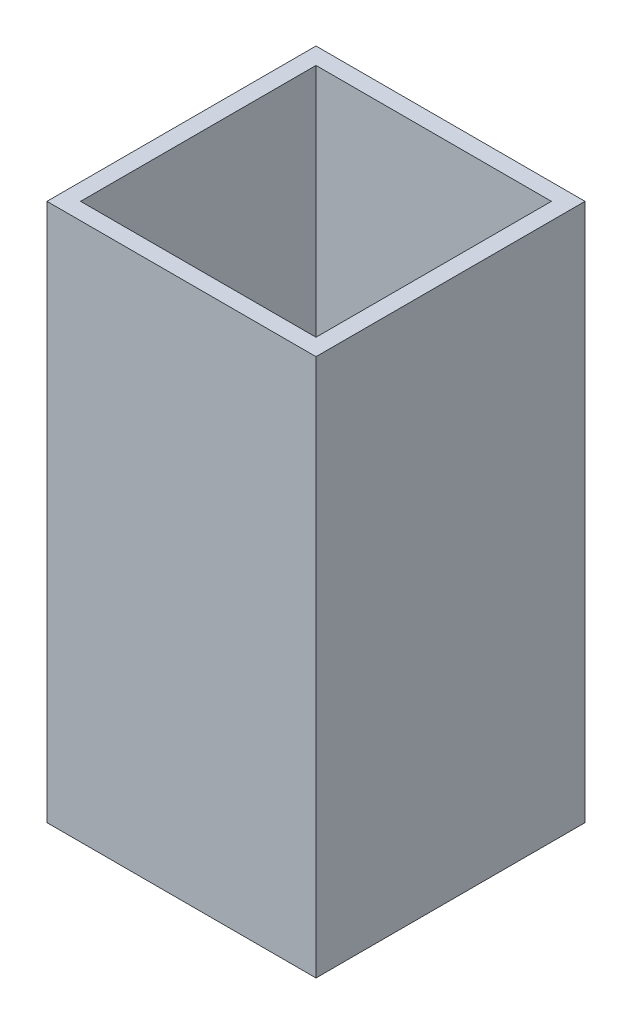
ISO-10303-21;
HEADER;
FILE_DESCRIPTION(('STEP AP214'),'2;1');
FILE_NAME('part.step','',(''),(''),'','','');
FILE_SCHEMA(('AUTOMOTIVE_DESIGN { 1 0 10303 214 1 1 1 1 }'));
ENDSEC;
DATA;
#1=APPLICATION_CONTEXT('core data for automotive mechanical design processes');
#2=APPLICATION_PROTOCOL_DEFINITION('international standard','automotive_design',2000,#1);
#3=PRODUCT_CONTEXT('',#1,'mechanical');
#4=PRODUCT('Part','Part','',(#3));
#5=PRODUCT_RELATED_PRODUCT_CATEGORY('part','',(#4));
#6=PRODUCT_DEFINITION_FORMATION('','',#4);
#7=PRODUCT_DEFINITION_CONTEXT('part definition',#1,'design');
#8=PRODUCT_DEFINITION('design','',#6,#7);
#9=PRODUCT_DEFINITION_SHAPE('','',#8);
#10=(LENGTH_UNIT() NAMED_UNIT(*) SI_UNIT(.MILLI.,.METRE.));
#11=(NAMED_UNIT(*) PLANE_ANGLE_UNIT() SI_UNIT($,.RADIAN.));
#12=(NAMED_UNIT(*) SI_UNIT($,.STERADIAN.) SOLID_ANGLE_UNIT());
#13=UNCERTAINTY_MEASURE_WITH_UNIT(LENGTH_MEASURE(1.E-05),#10,'distance_accuracy_value','');
#14=(GEOMETRIC_REPRESENTATION_CONTEXT(3) GLOBAL_UNCERTAINTY_ASSIGNED_CONTEXT((#13)) GLOBAL_UNIT_ASSIGNED_CONTEXT((#10,
#11,#12)) REPRESENTATION_CONTEXT('',''));
#15=CARTESIAN_POINT('',(0.,0.,0.));
#16=DIRECTION('',(0.,0.,1.));
#17=DIRECTION('',(1.,0.,0.));
#18=AXIS2_PLACEMENT_3D('',#15,#16,#17);
#19=CARTESIAN_POINT('',(0.,50.8,0.));
#20=DIRECTION('',(0.,-1.,0.));
#21=DIRECTION('',(0.,0.,-1.));
#22=AXIS2_PLACEMENT_3D('',#19,#20,#21);
#23=PLANE('',#22);
#24=DIRECTION('',(0.,0.,1.));
#25=VECTOR('',#24,1.);
#26=CARTESIAN_POINT('',(-12.7,50.8,-12.7));
#27=LINE('',#26,#25);
#28=CARTESIAN_POINT('',(-12.7,50.8,-12.7));
#29=VERTEX_POINT('',#28);
#30=CARTESIAN_POINT('',(-12.7,50.8,12.7));
#31=VERTEX_POINT('',#30);
#32=EDGE_CURVE('E136',#29,#31,#27,.T.);
#33=ORIENTED_EDGE('',*,*,#32,.T.);
#34=DIRECTION('',(1.,0.,0.));
#35=VECTOR('',#34,1.);
#36=CARTESIAN_POINT('',(12.7,50.8,12.7));
#37=LINE('',#36,#35);
#38=CARTESIAN_POINT('',(12.7,50.8,12.7));
#39=VERTEX_POINT('',#38);
#40=EDGE_CURVE('E139',#31,#39,#37,.T.);
#41=ORIENTED_EDGE('',*,*,#40,.T.);
#42=DIRECTION('',(0.,0.,-1.));
#43=VECTOR('',#42,1.);
#44=CARTESIAN_POINT('',(12.7,50.8,-12.7));
#45=LINE('',#44,#43);
#46=CARTESIAN_POINT('',(12.7,50.8,-12.7));
#47=VERTEX_POINT('',#46);
#48=EDGE_CURVE('E142',#39,#47,#45,.T.);
#49=ORIENTED_EDGE('',*,*,#48,.T.);
#50=DIRECTION('',(-1.,0.,0.));
#51=VECTOR('',#50,1.);
#52=CARTESIAN_POINT('',(12.7,50.8,-12.7));
#53=LINE('',#52,#51);
#54=EDGE_CURVE('E144',#47,#29,#53,.T.);
#55=ORIENTED_EDGE('',*,*,#54,.T.);
#56=EDGE_LOOP('',(#33,#41,#49,#55));
#57=FACE_BOUND('',#56,.T.);
#58=DIRECTION('',(0.,0.,1.));
#59=VECTOR('',#58,1.);
#60=CARTESIAN_POINT('',(-11.1125,50.8,-11.1125));
#61=LINE('',#60,#59);
#62=CARTESIAN_POINT('',(-11.1125,50.8,-11.1125));
#63=VERTEX_POINT('',#62);
#64=CARTESIAN_POINT('',(-11.1125,50.8,11.1125));
#65=VERTEX_POINT('',#64);
#66=EDGE_CURVE('E100',#63,#65,#61,.T.);
#67=ORIENTED_EDGE('',*,*,#66,.F.);
#68=DIRECTION('',(-1.,0.,0.));
#69=VECTOR('',#68,1.);
#70=CARTESIAN_POINT('',(11.1125,50.8,-11.1125));
#71=LINE('',#70,#69);
#72=CARTESIAN_POINT('',(11.1125,50.8,-11.1125));
#73=VERTEX_POINT('',#72);
#74=EDGE_CURVE('E122',#73,#63,#71,.T.);
#75=ORIENTED_EDGE('',*,*,#74,.F.);
#76=DIRECTION('',(0.,0.,-1.));
#77=VECTOR('',#76,1.);
#78=CARTESIAN_POINT('',(11.1125,50.8,-11.1125));
#79=LINE('',#78,#77);
#80=CARTESIAN_POINT('',(11.1125,50.8,11.1125));
#81=VERTEX_POINT('',#80);
#82=EDGE_CURVE('E120',#81,#73,#79,.T.);
#83=ORIENTED_EDGE('',*,*,#82,.F.);
#84=DIRECTION('',(1.,0.,0.));
#85=VECTOR('',#84,1.);
#86=CARTESIAN_POINT('',(11.1125,50.8,11.1125));
#87=LINE('',#86,#85);
#88=EDGE_CURVE('E108',#65,#81,#87,.T.);
#89=ORIENTED_EDGE('',*,*,#88,.F.);
#90=EDGE_LOOP('',(#67,#75,#83,#89));
#91=FACE_BOUND('',#90,.T.);
#92=ADVANCED_FACE('F35',(#57,#91),#23,.F.);
#93=CARTESIAN_POINT('',(0.,0.,0.));
#94=DIRECTION('',(0.,-1.,0.));
#95=DIRECTION('',(0.,0.,-1.));
#96=AXIS2_PLACEMENT_3D('',#93,#94,#95);
#97=PLANE('',#96);
#98=DIRECTION('',(0.,0.,1.));
#99=VECTOR('',#98,1.);
#100=CARTESIAN_POINT('',(-12.7,0.,-12.7));
#101=LINE('',#100,#99);
#102=CARTESIAN_POINT('',(-12.7,0.,-12.7));
#103=VERTEX_POINT('',#102);
#104=CARTESIAN_POINT('',(-12.7,0.,12.7));
#105=VERTEX_POINT('',#104);
#106=EDGE_CURVE('E116',#103,#105,#101,.T.);
#107=ORIENTED_EDGE('',*,*,#106,.F.);
#108=DIRECTION('',(-1.,0.,0.));
#109=VECTOR('',#108,1.);
#110=CARTESIAN_POINT('',(12.7,0.,-12.7));
#111=LINE('',#110,#109);
#112=CARTESIAN_POINT('',(12.7,0.,-12.7));
#113=VERTEX_POINT('',#112);
#114=EDGE_CURVE('E140',#113,#103,#111,.T.);
#115=ORIENTED_EDGE('',*,*,#114,.F.);
#116=DIRECTION('',(0.,0.,-1.));
#117=VECTOR('',#116,1.);
#118=CARTESIAN_POINT('',(12.7,0.,-12.7));
#119=LINE('',#118,#117);
#120=CARTESIAN_POINT('',(12.7,0.,12.7));
#121=VERTEX_POINT('',#120);
#122=EDGE_CURVE('E151',#121,#113,#119,.T.);
#123=ORIENTED_EDGE('',*,*,#122,.F.);
#124=DIRECTION('',(1.,0.,0.));
#125=VECTOR('',#124,1.);
#126=CARTESIAN_POINT('',(12.7,0.,12.7));
#127=LINE('',#126,#125);
#128=EDGE_CURVE('E149',#105,#121,#127,.T.);
#129=ORIENTED_EDGE('',*,*,#128,.F.);
#130=EDGE_LOOP('',(#107,#115,#123,#129));
#131=FACE_BOUND('',#130,.T.);
#132=DIRECTION('',(-1.,0.,0.));
#133=VECTOR('',#132,1.);
#134=CARTESIAN_POINT('',(11.1125,0.,-11.1125));
#135=LINE('',#134,#133);
#136=CARTESIAN_POINT('',(11.1125,0.,-11.1125));
#137=VERTEX_POINT('',#136);
#138=CARTESIAN_POINT('',(-11.1125,0.,-11.1125));
#139=VERTEX_POINT('',#138);
#140=EDGE_CURVE('E109',#137,#139,#135,.T.);
#141=ORIENTED_EDGE('',*,*,#140,.T.);
#142=DIRECTION('',(0.,0.,1.));
#143=VECTOR('',#142,1.);
#144=CARTESIAN_POINT('',(-11.1125,0.,-11.1125));
#145=LINE('',#144,#143);
#146=CARTESIAN_POINT('',(-11.1125,0.,11.1125));
#147=VERTEX_POINT('',#146);
#148=EDGE_CURVE('E58',#139,#147,#145,.T.);
#149=ORIENTED_EDGE('',*,*,#148,.T.);
#150=DIRECTION('',(1.,0.,0.));
#151=VECTOR('',#150,1.);
#152=CARTESIAN_POINT('',(11.1125,0.,11.1125));
#153=LINE('',#152,#151);
#154=CARTESIAN_POINT('',(11.1125,0.,11.1125));
#155=VERTEX_POINT('',#154);
#156=EDGE_CURVE('E115',#147,#155,#153,.T.);
#157=ORIENTED_EDGE('',*,*,#156,.T.);
#158=DIRECTION('',(0.,0.,-1.));
#159=VECTOR('',#158,1.);
#160=CARTESIAN_POINT('',(11.1125,0.,-11.1125));
#161=LINE('',#160,#159);
#162=EDGE_CURVE('E128',#155,#137,#161,.T.);
#163=ORIENTED_EDGE('',*,*,#162,.T.);
#164=EDGE_LOOP('',(#141,#149,#157,#163));
#165=FACE_BOUND('',#164,.T.);
#166=ADVANCED_FACE('F169',(#131,#165),#97,.T.);
#167=CARTESIAN_POINT('',(-12.7,50.8,-12.7));
#168=DIRECTION('',(1.,0.,0.));
#169=DIRECTION('',(0.,0.,-1.));
#170=AXIS2_PLACEMENT_3D('',#167,#168,#169);
#171=PLANE('',#170);
#172=ORIENTED_EDGE('',*,*,#106,.T.);
#173=DIRECTION('',(0.,-1.,0.));
#174=VECTOR('',#173,1.);
#175=CARTESIAN_POINT('',(-12.7,50.8,12.7));
#176=LINE('',#175,#174);
#177=EDGE_CURVE('E11',#31,#105,#176,.T.);
#178=ORIENTED_EDGE('',*,*,#177,.F.);
#179=ORIENTED_EDGE('',*,*,#32,.F.);
#180=DIRECTION('',(0.,-1.,0.));
#181=VECTOR('',#180,1.);
#182=CARTESIAN_POINT('',(-12.7,50.8,-12.7));
#183=LINE('',#182,#181);
#184=EDGE_CURVE('E146',#29,#103,#183,.T.);
#185=ORIENTED_EDGE('',*,*,#184,.T.);
#186=EDGE_LOOP('',(#172,#178,#179,#185));
#187=FACE_BOUND('',#186,.T.);
#188=ADVANCED_FACE('F37',(#187),#171,.F.);
#189=CARTESIAN_POINT('',(12.7,50.8,12.7));
#190=DIRECTION('',(0.,0.,-1.));
#191=DIRECTION('',(-1.,0.,0.));
#192=AXIS2_PLACEMENT_3D('',#189,#190,#191);
#193=PLANE('',#192);
#194=ORIENTED_EDGE('',*,*,#128,.T.);
#195=DIRECTION('',(0.,-1.,0.));
#196=VECTOR('',#195,1.);
#197=CARTESIAN_POINT('',(12.7,50.8,12.7));
#198=LINE('',#197,#196);
#199=EDGE_CURVE('E43',#39,#121,#198,.T.);
#200=ORIENTED_EDGE('',*,*,#199,.F.);
#201=ORIENTED_EDGE('',*,*,#40,.F.);
#202=ORIENTED_EDGE('',*,*,#177,.T.);
#203=EDGE_LOOP('',(#194,#200,#201,#202));
#204=FACE_BOUND('',#203,.T.);
#205=ADVANCED_FACE('F179',(#204),#193,.F.);
#206=CARTESIAN_POINT('',(12.7,50.8,-12.7));
#207=DIRECTION('',(-1.,0.,0.));
#208=DIRECTION('',(0.,0.,1.));
#209=AXIS2_PLACEMENT_3D('',#206,#207,#208);
#210=PLANE('',#209);
#211=ORIENTED_EDGE('',*,*,#122,.T.);
#212=DIRECTION('',(0.,-1.,0.));
#213=VECTOR('',#212,1.);
#214=CARTESIAN_POINT('',(12.7,50.8,-12.7));
#215=LINE('',#214,#213);
#216=EDGE_CURVE('E156',#47,#113,#215,.T.);
#217=ORIENTED_EDGE('',*,*,#216,.F.);
#218=ORIENTED_EDGE('',*,*,#48,.F.);
#219=ORIENTED_EDGE('',*,*,#199,.T.);
#220=EDGE_LOOP('',(#211,#217,#218,#219));
#221=FACE_BOUND('',#220,.T.);
#222=ADVANCED_FACE('F163',(#221),#210,.F.);
#223=CARTESIAN_POINT('',(12.7,50.8,-12.7));
#224=DIRECTION('',(0.,0.,1.));
#225=DIRECTION('',(1.,0.,0.));
#226=AXIS2_PLACEMENT_3D('',#223,#224,#225);
#227=PLANE('',#226);
#228=ORIENTED_EDGE('',*,*,#114,.T.);
#229=ORIENTED_EDGE('',*,*,#184,.F.);
#230=ORIENTED_EDGE('',*,*,#54,.F.);
#231=ORIENTED_EDGE('',*,*,#216,.T.);
#232=EDGE_LOOP('',(#228,#229,#230,#231));
#233=FACE_BOUND('',#232,.T.);
#234=ADVANCED_FACE('F173',(#233),#227,.F.);
#235=CARTESIAN_POINT('',(-11.1125,50.8,-11.1125));
#236=DIRECTION('',(1.,0.,0.));
#237=DIRECTION('',(0.,0.,-1.));
#238=AXIS2_PLACEMENT_3D('',#235,#236,#237);
#239=PLANE('',#238);
#240=ORIENTED_EDGE('',*,*,#148,.F.);
#241=DIRECTION('',(0.,-1.,0.));
#242=VECTOR('',#241,1.);
#243=CARTESIAN_POINT('',(-11.1125,50.8,-11.1125));
#244=LINE('',#243,#242);
#245=EDGE_CURVE('E104',#63,#139,#244,.T.);
#246=ORIENTED_EDGE('',*,*,#245,.F.);
#247=ORIENTED_EDGE('',*,*,#66,.T.);
#248=DIRECTION('',(0.,-1.,0.));
#249=VECTOR('',#248,1.);
#250=CARTESIAN_POINT('',(-11.1125,50.8,11.1125));
#251=LINE('',#250,#249);
#252=EDGE_CURVE('E103',#65,#147,#251,.T.);
#253=ORIENTED_EDGE('',*,*,#252,.T.);
#254=EDGE_LOOP('',(#240,#246,#247,#253));
#255=FACE_BOUND('',#254,.T.);
#256=ADVANCED_FACE('F102',(#255),#239,.T.);
#257=CARTESIAN_POINT('',(11.1125,50.8,11.1125));
#258=DIRECTION('',(0.,0.,-1.));
#259=DIRECTION('',(-1.,0.,0.));
#260=AXIS2_PLACEMENT_3D('',#257,#258,#259);
#261=PLANE('',#260);
#262=ORIENTED_EDGE('',*,*,#156,.F.);
#263=ORIENTED_EDGE('',*,*,#252,.F.);
#264=ORIENTED_EDGE('',*,*,#88,.T.);
#265=DIRECTION('',(0.,-1.,0.));
#266=VECTOR('',#265,1.);
#267=CARTESIAN_POINT('',(11.1125,50.8,11.1125));
#268=LINE('',#267,#266);
#269=EDGE_CURVE('E117',#81,#155,#268,.T.);
#270=ORIENTED_EDGE('',*,*,#269,.T.);
#271=EDGE_LOOP('',(#262,#263,#264,#270));
#272=FACE_BOUND('',#271,.T.);
#273=ADVANCED_FACE('F112',(#272),#261,.T.);
#274=CARTESIAN_POINT('',(11.1125,50.8,-11.1125));
#275=DIRECTION('',(-1.,0.,0.));
#276=DIRECTION('',(0.,0.,1.));
#277=AXIS2_PLACEMENT_3D('',#274,#275,#276);
#278=PLANE('',#277);
#279=ORIENTED_EDGE('',*,*,#162,.F.);
#280=ORIENTED_EDGE('',*,*,#269,.F.);
#281=ORIENTED_EDGE('',*,*,#82,.T.);
#282=DIRECTION('',(0.,-1.,0.));
#283=VECTOR('',#282,1.);
#284=CARTESIAN_POINT('',(11.1125,50.8,-11.1125));
#285=LINE('',#284,#283);
#286=EDGE_CURVE('E50',#73,#137,#285,.T.);
#287=ORIENTED_EDGE('',*,*,#286,.T.);
#288=EDGE_LOOP('',(#279,#280,#281,#287));
#289=FACE_BOUND('',#288,.T.);
#290=ADVANCED_FACE('F202',(#289),#278,.T.);
#291=CARTESIAN_POINT('',(11.1125,50.8,-11.1125));
#292=DIRECTION('',(0.,0.,1.));
#293=DIRECTION('',(1.,0.,0.));
#294=AXIS2_PLACEMENT_3D('',#291,#292,#293);
#295=PLANE('',#294);
#296=ORIENTED_EDGE('',*,*,#140,.F.);
#297=ORIENTED_EDGE('',*,*,#286,.F.);
#298=ORIENTED_EDGE('',*,*,#74,.T.);
#299=ORIENTED_EDGE('',*,*,#245,.T.);
#300=EDGE_LOOP('',(#296,#297,#298,#299));
#301=FACE_BOUND('',#300,.T.);
#302=ADVANCED_FACE('F206',(#301),#295,.T.);
#303=CLOSED_SHELL('',(#92,#166,#188,#205,#222,#234,#256,#273,#290,#302));
#304=MANIFOLD_SOLID_BREP('B2',#303);
#305=ADVANCED_BREP_SHAPE_REPRESENTATION('',(#18,#304),#14);
#306=SHAPE_DEFINITION_REPRESENTATION(#9,#305);
ENDSEC;
END-ISO-10303-21;
